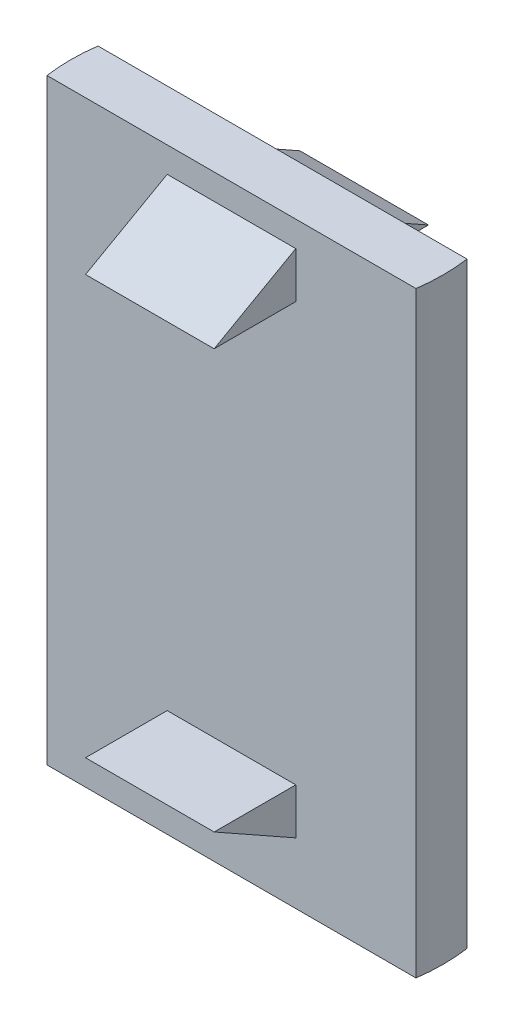
ISO-10303-21;
HEADER;
FILE_DESCRIPTION(('STEP AP214'),'2;1');
FILE_NAME('part.step','',(''),(''),'','','');
FILE_SCHEMA(('AUTOMOTIVE_DESIGN { 1 0 10303 214 1 1 1 1 }'));
ENDSEC;
DATA;
#1=APPLICATION_CONTEXT('core data for automotive mechanical design processes');
#2=APPLICATION_PROTOCOL_DEFINITION('international standard','automotive_design',2000,#1);
#3=PRODUCT_CONTEXT('',#1,'mechanical');
#4=PRODUCT('Part','Part','',(#3));
#5=PRODUCT_RELATED_PRODUCT_CATEGORY('part','',(#4));
#6=PRODUCT_DEFINITION_FORMATION('','',#4);
#7=PRODUCT_DEFINITION_CONTEXT('part definition',#1,'design');
#8=PRODUCT_DEFINITION('design','',#6,#7);
#9=PRODUCT_DEFINITION_SHAPE('','',#8);
#10=(LENGTH_UNIT() NAMED_UNIT(*) SI_UNIT(.MILLI.,.METRE.));
#11=(NAMED_UNIT(*) PLANE_ANGLE_UNIT() SI_UNIT($,.RADIAN.));
#12=(NAMED_UNIT(*) SI_UNIT($,.STERADIAN.) SOLID_ANGLE_UNIT());
#13=UNCERTAINTY_MEASURE_WITH_UNIT(LENGTH_MEASURE(1.E-05),#10,'distance_accuracy_value','');
#14=(GEOMETRIC_REPRESENTATION_CONTEXT(3) GLOBAL_UNCERTAINTY_ASSIGNED_CONTEXT((#13)) GLOBAL_UNIT_ASSIGNED_CONTEXT((#10,
#11,#12)) REPRESENTATION_CONTEXT('',''));
#15=CARTESIAN_POINT('',(0.,0.,0.));
#16=DIRECTION('',(0.,0.,1.));
#17=DIRECTION('',(1.,0.,0.));
#18=AXIS2_PLACEMENT_3D('',#15,#16,#17);
#19=CARTESIAN_POINT('',(49.53,-180.34,12.7));
#20=DIRECTION('',(0.,1.,0.));
#21=DIRECTION('',(0.,0.,1.));
#22=AXIS2_PLACEMENT_3D('',#19,#20,#21);
#23=PLANE('',#22);
#24=DIRECTION('',(0.,0.,1.));
#25=VECTOR('',#24,1.);
#26=CARTESIAN_POINT('',(-25.4,-180.34,8.89));
#27=LINE('',#26,#25);
#28=CARTESIAN_POINT('',(-25.4,-180.34,3.81));
#29=VERTEX_POINT('',#28);
#30=CARTESIAN_POINT('',(-25.4,-180.34,8.89));
#31=VERTEX_POINT('',#30);
#32=EDGE_CURVE('E62',#29,#31,#27,.T.);
#33=ORIENTED_EDGE('',*,*,#32,.T.);
#34=DIRECTION('',(1.,0.,0.));
#35=VECTOR('',#34,1.);
#36=CARTESIAN_POINT('',(25.4,-180.34,8.88999999999999));
#37=LINE('',#36,#35);
#38=CARTESIAN_POINT('',(25.4,-180.34,8.88999999999999));
#39=VERTEX_POINT('',#38);
#40=EDGE_CURVE('E212',#31,#39,#37,.T.);
#41=ORIENTED_EDGE('',*,*,#40,.T.);
#42=DIRECTION('',(0.,0.,-1.));
#43=VECTOR('',#42,1.);
#44=CARTESIAN_POINT('',(25.4,-180.34,8.88999999999999));
#45=LINE('',#44,#43);
#46=CARTESIAN_POINT('',(25.4,-180.34,3.80999999999999));
#47=VERTEX_POINT('',#46);
#48=EDGE_CURVE('E228',#39,#47,#45,.T.);
#49=ORIENTED_EDGE('',*,*,#48,.T.);
#50=DIRECTION('',(-1.,0.,0.));
#51=VECTOR('',#50,1.);
#52=CARTESIAN_POINT('',(25.4,-180.34,3.80999999999999));
#53=LINE('',#52,#51);
#54=EDGE_CURVE('E224',#47,#29,#53,.T.);
#55=ORIENTED_EDGE('',*,*,#54,.T.);
#56=EDGE_LOOP('',(#33,#41,#49,#55));
#57=FACE_BOUND('',#56,.T.);
#58=CARTESIAN_POINT('',(0.,-180.34,6.35));
#59=DIRECTION('',(0.,1.,0.));
#60=DIRECTION('',(0.,0.,1.));
#61=AXIS2_PLACEMENT_3D('',#58,#59,#60);
#62=CIRCLE('',#61,46.355);
#63=CARTESIAN_POINT('',(45.918008722069,-180.34,12.7));
#64=VERTEX_POINT('',#63);
#65=CARTESIAN_POINT('',(45.918008722069,-180.34,0.));
#66=VERTEX_POINT('',#65);
#67=EDGE_CURVE('E194',#64,#66,#62,.T.);
#68=ORIENTED_EDGE('',*,*,#67,.F.);
#69=DIRECTION('',(1.,0.,0.));
#70=VECTOR('',#69,1.);
#71=CARTESIAN_POINT('',(49.53,-180.34,12.7));
#72=LINE('',#71,#70);
#73=CARTESIAN_POINT('',(-45.9180087220689,-180.34,12.7));
#74=VERTEX_POINT('',#73);
#75=EDGE_CURVE('E48',#74,#64,#72,.T.);
#76=ORIENTED_EDGE('',*,*,#75,.F.);
#77=CARTESIAN_POINT('',(-45.9180087220689,-180.34,0.));
#78=VERTEX_POINT('',#77);
#79=EDGE_CURVE('E384',#78,#74,#62,.T.);
#80=ORIENTED_EDGE('',*,*,#79,.F.);
#81=DIRECTION('',(1.,0.,0.));
#82=VECTOR('',#81,1.);
#83=CARTESIAN_POINT('',(49.53,-180.34,0.));
#84=LINE('',#83,#82);
#85=EDGE_CURVE('E376',#78,#66,#84,.T.);
#86=ORIENTED_EDGE('',*,*,#85,.T.);
#87=EDGE_LOOP('',(#68,#76,#80,#86));
#88=FACE_BOUND('',#87,.T.);
#89=ADVANCED_FACE('F40',(#57,#88),#23,.F.);
#90=CARTESIAN_POINT('',(0.,0.,12.7));
#91=DIRECTION('',(0.,0.,1.));
#92=DIRECTION('',(1.,0.,0.));
#93=AXIS2_PLACEMENT_3D('',#90,#91,#92);
#94=PLANE('',#93);
#95=DIRECTION('',(1.,0.,0.));
#96=VECTOR('',#95,1.);
#97=CARTESIAN_POINT('',(0.,-31.75,12.7));
#98=LINE('',#97,#96);
#99=CARTESIAN_POINT('',(-45.9180087220689,-31.75,12.7));
#100=VERTEX_POINT('',#99);
#101=CARTESIAN_POINT('',(45.918008722069,-31.75,12.7));
#102=VERTEX_POINT('',#101);
#103=EDGE_CURVE('E54',#100,#102,#98,.T.);
#104=ORIENTED_EDGE('',*,*,#103,.F.);
#105=DIRECTION('',(0.,1.,0.));
#106=VECTOR('',#105,1.);
#107=CARTESIAN_POINT('',(-45.9180087220689,-180.34,12.7));
#108=LINE('',#107,#106);
#109=EDGE_CURVE('E196',#100,#74,#108,.F.);
#110=ORIENTED_EDGE('',*,*,#109,.T.);
#111=ORIENTED_EDGE('',*,*,#75,.T.);
#112=DIRECTION('',(0.,1.,0.));
#113=VECTOR('',#112,1.);
#114=CARTESIAN_POINT('',(45.918008722069,-180.34,12.7));
#115=LINE('',#114,#113);
#116=EDGE_CURVE('E200',#64,#102,#115,.T.);
#117=ORIENTED_EDGE('',*,*,#116,.T.);
#118=EDGE_LOOP('',(#104,#110,#111,#117));
#119=FACE_BOUND('',#118,.T.);
#120=DIRECTION('',(1.,0.,0.));
#121=VECTOR('',#120,1.);
#122=CARTESIAN_POINT('',(0.,-165.1,12.7));
#123=LINE('',#122,#121);
#124=CARTESIAN_POINT('',(-16.002,-165.1,12.7));
#125=VERTEX_POINT('',#124);
#126=CARTESIAN_POINT('',(16.002,-165.1,12.7));
#127=VERTEX_POINT('',#126);
#128=EDGE_CURVE('E283',#125,#127,#123,.T.);
#129=ORIENTED_EDGE('',*,*,#128,.F.);
#130=DIRECTION('',(0.,1.,0.));
#131=VECTOR('',#130,1.);
#132=CARTESIAN_POINT('',(-16.002,0.,12.7));
#133=LINE('',#132,#131);
#134=CARTESIAN_POINT('',(-16.002,-153.67,12.7));
#135=VERTEX_POINT('',#134);
#136=EDGE_CURVE('E274',#125,#135,#133,.T.);
#137=ORIENTED_EDGE('',*,*,#136,.T.);
#138=DIRECTION('',(1.,0.,0.));
#139=VECTOR('',#138,1.);
#140=CARTESIAN_POINT('',(0.,-153.67,12.7));
#141=LINE('',#140,#139);
#142=CARTESIAN_POINT('',(16.002,-153.67,12.7));
#143=VERTEX_POINT('',#142);
#144=EDGE_CURVE('E280',#135,#143,#141,.T.);
#145=ORIENTED_EDGE('',*,*,#144,.T.);
#146=DIRECTION('',(0.,1.,0.));
#147=VECTOR('',#146,1.);
#148=CARTESIAN_POINT('',(16.002,0.,12.7));
#149=LINE('',#148,#147);
#150=EDGE_CURVE('E286',#127,#143,#149,.T.);
#151=ORIENTED_EDGE('',*,*,#150,.F.);
#152=EDGE_LOOP('',(#129,#137,#145,#151));
#153=FACE_BOUND('',#152,.T.);
#154=DIRECTION('',(0.,1.,0.));
#155=VECTOR('',#154,1.);
#156=CARTESIAN_POINT('',(-16.002,0.,12.7));
#157=LINE('',#156,#155);
#158=CARTESIAN_POINT('',(-16.002,-49.53,12.7));
#159=VERTEX_POINT('',#158);
#160=CARTESIAN_POINT('',(-16.002,-38.0999999999999,12.7));
#161=VERTEX_POINT('',#160);
#162=EDGE_CURVE('E304',#159,#161,#157,.T.);
#163=ORIENTED_EDGE('',*,*,#162,.T.);
#164=DIRECTION('',(1.,0.,0.));
#165=VECTOR('',#164,1.);
#166=CARTESIAN_POINT('',(0.,-38.0999999999999,12.7));
#167=LINE('',#166,#165);
#168=CARTESIAN_POINT('',(16.002,-38.0999999999999,12.7));
#169=VERTEX_POINT('',#168);
#170=EDGE_CURVE('E312',#161,#169,#167,.T.);
#171=ORIENTED_EDGE('',*,*,#170,.T.);
#172=DIRECTION('',(0.,1.,0.));
#173=VECTOR('',#172,1.);
#174=CARTESIAN_POINT('',(16.002,0.,12.7));
#175=LINE('',#174,#173);
#176=CARTESIAN_POINT('',(16.002,-49.53,12.7));
#177=VERTEX_POINT('',#176);
#178=EDGE_CURVE('E308',#177,#169,#175,.T.);
#179=ORIENTED_EDGE('',*,*,#178,.F.);
#180=DIRECTION('',(1.,0.,0.));
#181=VECTOR('',#180,1.);
#182=CARTESIAN_POINT('',(0.,-49.53,12.7));
#183=LINE('',#182,#181);
#184=EDGE_CURVE('E299',#159,#177,#183,.T.);
#185=ORIENTED_EDGE('',*,*,#184,.F.);
#186=EDGE_LOOP('',(#163,#171,#179,#185));
#187=FACE_BOUND('',#186,.T.);
#188=ADVANCED_FACE('F395',(#119,#153,#187),#94,.T.);
#189=CARTESIAN_POINT('',(0.,0.,0.));
#190=DIRECTION('',(0.,0.,1.));
#191=DIRECTION('',(1.,0.,0.));
#192=AXIS2_PLACEMENT_3D('',#189,#190,#191);
#193=PLANE('',#192);
#194=DIRECTION('',(0.,1.,0.));
#195=VECTOR('',#194,1.);
#196=CARTESIAN_POINT('',(16.002,0.,0.));
#197=LINE('',#196,#195);
#198=CARTESIAN_POINT('',(16.002,-49.53,0.));
#199=VERTEX_POINT('',#198);
#200=CARTESIAN_POINT('',(16.002,-38.0999999999999,0.));
#201=VERTEX_POINT('',#200);
#202=EDGE_CURVE('E357',#199,#201,#197,.T.);
#203=ORIENTED_EDGE('',*,*,#202,.T.);
#204=DIRECTION('',(1.,0.,0.));
#205=VECTOR('',#204,1.);
#206=CARTESIAN_POINT('',(0.,-38.0999999999999,0.));
#207=LINE('',#206,#205);
#208=CARTESIAN_POINT('',(-16.002,-38.0999999999999,0.));
#209=VERTEX_POINT('',#208);
#210=EDGE_CURVE('E365',#209,#201,#207,.T.);
#211=ORIENTED_EDGE('',*,*,#210,.F.);
#212=DIRECTION('',(0.,1.,0.));
#213=VECTOR('',#212,1.);
#214=CARTESIAN_POINT('',(-16.002,0.,0.));
#215=LINE('',#214,#213);
#216=CARTESIAN_POINT('',(-16.002,-49.53,0.));
#217=VERTEX_POINT('',#216);
#218=EDGE_CURVE('E361',#217,#209,#215,.T.);
#219=ORIENTED_EDGE('',*,*,#218,.F.);
#220=DIRECTION('',(1.,0.,0.));
#221=VECTOR('',#220,1.);
#222=CARTESIAN_POINT('',(0.,-49.53,0.));
#223=LINE('',#222,#221);
#224=EDGE_CURVE('E351',#217,#199,#223,.T.);
#225=ORIENTED_EDGE('',*,*,#224,.T.);
#226=EDGE_LOOP('',(#203,#211,#219,#225));
#227=FACE_BOUND('',#226,.T.);
#228=DIRECTION('',(1.,0.,0.));
#229=VECTOR('',#228,1.);
#230=CARTESIAN_POINT('',(0.,-165.1,0.));
#231=LINE('',#230,#229);
#232=CARTESIAN_POINT('',(-16.002,-165.1,0.));
#233=VERTEX_POINT('',#232);
#234=CARTESIAN_POINT('',(16.002,-165.1,0.));
#235=VERTEX_POINT('',#234);
#236=EDGE_CURVE('E331',#233,#235,#231,.T.);
#237=ORIENTED_EDGE('',*,*,#236,.T.);
#238=DIRECTION('',(0.,1.,0.));
#239=VECTOR('',#238,1.);
#240=CARTESIAN_POINT('',(16.002,0.,0.));
#241=LINE('',#240,#239);
#242=CARTESIAN_POINT('',(16.002,-153.67,0.));
#243=VERTEX_POINT('',#242);
#244=EDGE_CURVE('E339',#235,#243,#241,.T.);
#245=ORIENTED_EDGE('',*,*,#244,.T.);
#246=DIRECTION('',(1.,0.,0.));
#247=VECTOR('',#246,1.);
#248=CARTESIAN_POINT('',(0.,-153.67,0.));
#249=LINE('',#248,#247);
#250=CARTESIAN_POINT('',(-16.002,-153.67,0.));
#251=VERTEX_POINT('',#250);
#252=EDGE_CURVE('E335',#251,#243,#249,.T.);
#253=ORIENTED_EDGE('',*,*,#252,.F.);
#254=DIRECTION('',(0.,1.,0.));
#255=VECTOR('',#254,1.);
#256=CARTESIAN_POINT('',(-16.002,0.,0.));
#257=LINE('',#256,#255);
#258=EDGE_CURVE('E326',#233,#251,#257,.T.);
#259=ORIENTED_EDGE('',*,*,#258,.F.);
#260=EDGE_LOOP('',(#237,#245,#253,#259));
#261=FACE_BOUND('',#260,.T.);
#262=DIRECTION('',(0.,1.,0.));
#263=VECTOR('',#262,1.);
#264=CARTESIAN_POINT('',(-45.9180087220689,-180.34,0.));
#265=LINE('',#264,#263);
#266=CARTESIAN_POINT('',(-45.9180087220689,-31.75,0.));
#267=VERTEX_POINT('',#266);
#268=EDGE_CURVE('E189',#267,#78,#265,.F.);
#269=ORIENTED_EDGE('',*,*,#268,.F.);
#270=DIRECTION('',(1.,0.,0.));
#271=VECTOR('',#270,1.);
#272=CARTESIAN_POINT('',(0.,-31.75,0.));
#273=LINE('',#272,#271);
#274=CARTESIAN_POINT('',(45.918008722069,-31.75,0.));
#275=VERTEX_POINT('',#274);
#276=EDGE_CURVE('E177',#267,#275,#273,.T.);
#277=ORIENTED_EDGE('',*,*,#276,.T.);
#278=DIRECTION('',(0.,1.,0.));
#279=VECTOR('',#278,1.);
#280=CARTESIAN_POINT('',(45.918008722069,-180.34,0.));
#281=LINE('',#280,#279);
#282=EDGE_CURVE('E187',#66,#275,#281,.T.);
#283=ORIENTED_EDGE('',*,*,#282,.F.);
#284=ORIENTED_EDGE('',*,*,#85,.F.);
#285=EDGE_LOOP('',(#269,#277,#283,#284));
#286=FACE_BOUND('',#285,.T.);
#287=ADVANCED_FACE('F185',(#227,#261,#286),#193,.F.);
#288=CARTESIAN_POINT('',(0.,-49.53,-20.32));
#289=DIRECTION('',(0.,-1.,0.));
#290=DIRECTION('',(0.,0.,-1.));
#291=AXIS2_PLACEMENT_3D('',#288,#289,#290);
#292=PLANE('',#291);
#293=ORIENTED_EDGE('',*,*,#224,.F.);
#294=DIRECTION('',(0.,0.,1.));
#295=VECTOR('',#294,1.);
#296=CARTESIAN_POINT('',(-16.002,-49.53,-20.32));
#297=LINE('',#296,#295);
#298=CARTESIAN_POINT('',(-16.002,-49.53,-20.32));
#299=VERTEX_POINT('',#298);
#300=EDGE_CURVE('E373',#299,#217,#297,.T.);
#301=ORIENTED_EDGE('',*,*,#300,.F.);
#302=DIRECTION('',(1.,0.,0.));
#303=VECTOR('',#302,1.);
#304=CARTESIAN_POINT('',(0.,-49.53,-20.32));
#305=LINE('',#304,#303);
#306=CARTESIAN_POINT('',(16.002,-49.53,-20.32));
#307=VERTEX_POINT('',#306);
#308=EDGE_CURVE('E352',#299,#307,#305,.T.);
#309=ORIENTED_EDGE('',*,*,#308,.T.);
#310=DIRECTION('',(0.,0.,1.));
#311=VECTOR('',#310,1.);
#312=CARTESIAN_POINT('',(16.002,-49.53,-20.32));
#313=LINE('',#312,#311);
#314=EDGE_CURVE('E356',#307,#199,#313,.T.);
#315=ORIENTED_EDGE('',*,*,#314,.T.);
#316=EDGE_LOOP('',(#293,#301,#309,#315));
#317=FACE_BOUND('',#316,.T.);
#318=ADVANCED_FACE('F499',(#317),#292,.T.);
#319=CARTESIAN_POINT('',(-16.002,0.,-20.32));
#320=DIRECTION('',(1.,0.,0.));
#321=DIRECTION('',(0.,0.,-1.));
#322=AXIS2_PLACEMENT_3D('',#319,#320,#321);
#323=PLANE('',#322);
#324=ORIENTED_EDGE('',*,*,#218,.T.);
#325=DIRECTION('',(0.,-0.490261239632559,-0.871575537124549));
#326=VECTOR('',#325,1.);
#327=CARTESIAN_POINT('',(-16.002,-37.6251632047477,0.844154302670604));
#328=LINE('',#327,#326);
#329=EDGE_CURVE('E270',#209,#299,#328,.T.);
#330=ORIENTED_EDGE('',*,*,#329,.T.);
#331=ORIENTED_EDGE('',*,*,#300,.T.);
#332=EDGE_LOOP('',(#324,#330,#331));
#333=FACE_BOUND('',#332,.T.);
#334=ADVANCED_FACE('F495',(#333),#323,.F.);
#335=CARTESIAN_POINT('',(16.002,0.,-20.32));
#336=DIRECTION('',(1.,0.,0.));
#337=DIRECTION('',(0.,0.,-1.));
#338=AXIS2_PLACEMENT_3D('',#335,#336,#337);
#339=PLANE('',#338);
#340=DIRECTION('',(0.,-0.490261239632559,-0.871575537124549));
#341=VECTOR('',#340,1.);
#342=CARTESIAN_POINT('',(16.002,-37.6251632047477,0.844154302670604));
#343=LINE('',#342,#341);
#344=EDGE_CURVE('E267',#201,#307,#343,.T.);
#345=ORIENTED_EDGE('',*,*,#344,.F.);
#346=ORIENTED_EDGE('',*,*,#202,.F.);
#347=ORIENTED_EDGE('',*,*,#314,.F.);
#348=EDGE_LOOP('',(#345,#346,#347));
#349=FACE_BOUND('',#348,.T.);
#350=ADVANCED_FACE('F491',(#349),#339,.T.);
#351=CARTESIAN_POINT('',(-16.002,0.,-20.32));
#352=DIRECTION('',(1.,0.,0.));
#353=DIRECTION('',(0.,0.,-1.));
#354=AXIS2_PLACEMENT_3D('',#351,#352,#353);
#355=PLANE('',#354);
#356=DIRECTION('',(0.,0.,1.));
#357=VECTOR('',#356,1.);
#358=CARTESIAN_POINT('',(-16.002,-153.67,-20.32));
#359=LINE('',#358,#357);
#360=CARTESIAN_POINT('',(-16.002,-153.67,-20.32));
#361=VERTEX_POINT('',#360);
#362=EDGE_CURVE('E348',#361,#251,#359,.T.);
#363=ORIENTED_EDGE('',*,*,#362,.F.);
#364=DIRECTION('',(0.,-0.490261239632561,0.871575537124548));
#365=VECTOR('',#364,1.);
#366=CARTESIAN_POINT('',(-16.002,-116.734480712166,-85.9831454005936));
#367=LINE('',#366,#365);
#368=EDGE_CURVE('E263',#361,#233,#367,.T.);
#369=ORIENTED_EDGE('',*,*,#368,.T.);
#370=ORIENTED_EDGE('',*,*,#258,.T.);
#371=EDGE_LOOP('',(#363,#369,#370));
#372=FACE_BOUND('',#371,.T.);
#373=ADVANCED_FACE('F487',(#372),#355,.F.);
#374=CARTESIAN_POINT('',(0.,-153.67,-20.32));
#375=DIRECTION('',(0.,-1.,0.));
#376=DIRECTION('',(0.,0.,-1.));
#377=AXIS2_PLACEMENT_3D('',#374,#375,#376);
#378=PLANE('',#377);
#379=ORIENTED_EDGE('',*,*,#252,.T.);
#380=DIRECTION('',(0.,0.,1.));
#381=VECTOR('',#380,1.);
#382=CARTESIAN_POINT('',(16.002,-153.67,-20.32));
#383=LINE('',#382,#381);
#384=CARTESIAN_POINT('',(16.002,-153.67,-20.32));
#385=VERTEX_POINT('',#384);
#386=EDGE_CURVE('E330',#385,#243,#383,.T.);
#387=ORIENTED_EDGE('',*,*,#386,.F.);
#388=DIRECTION('',(1.,0.,0.));
#389=VECTOR('',#388,1.);
#390=CARTESIAN_POINT('',(0.,-153.67,-20.32));
#391=LINE('',#390,#389);
#392=EDGE_CURVE('E327',#361,#385,#391,.T.);
#393=ORIENTED_EDGE('',*,*,#392,.F.);
#394=ORIENTED_EDGE('',*,*,#362,.T.);
#395=EDGE_LOOP('',(#379,#387,#393,#394));
#396=FACE_BOUND('',#395,.T.);
#397=ADVANCED_FACE('F483',(#396),#378,.F.);
#398=CARTESIAN_POINT('',(16.002,0.,-20.32));
#399=DIRECTION('',(1.,0.,0.));
#400=DIRECTION('',(0.,0.,-1.));
#401=AXIS2_PLACEMENT_3D('',#398,#399,#400);
#402=PLANE('',#401);
#403=DIRECTION('',(0.,-0.490261239632561,0.871575537124548));
#404=VECTOR('',#403,1.);
#405=CARTESIAN_POINT('',(16.002,-116.734480712166,-85.9831454005936));
#406=LINE('',#405,#404);
#407=EDGE_CURVE('E260',#385,#235,#406,.T.);
#408=ORIENTED_EDGE('',*,*,#407,.F.);
#409=ORIENTED_EDGE('',*,*,#386,.T.);
#410=ORIENTED_EDGE('',*,*,#244,.F.);
#411=EDGE_LOOP('',(#408,#409,#410));
#412=FACE_BOUND('',#411,.T.);
#413=ADVANCED_FACE('F479',(#412),#402,.T.);
#414=CARTESIAN_POINT('',(0.,-49.53,33.02));
#415=DIRECTION('',(0.,1.,0.));
#416=DIRECTION('',(0.,0.,1.));
#417=AXIS2_PLACEMENT_3D('',#414,#415,#416);
#418=PLANE('',#417);
#419=ORIENTED_EDGE('',*,*,#184,.T.);
#420=DIRECTION('',(0.,0.,-1.));
#421=VECTOR('',#420,1.);
#422=CARTESIAN_POINT('',(16.002,-49.53,33.02));
#423=LINE('',#422,#421);
#424=CARTESIAN_POINT('',(16.002,-49.53,33.02));
#425=VERTEX_POINT('',#424);
#426=EDGE_CURVE('E322',#425,#177,#423,.T.);
#427=ORIENTED_EDGE('',*,*,#426,.F.);
#428=DIRECTION('',(1.,0.,0.));
#429=VECTOR('',#428,1.);
#430=CARTESIAN_POINT('',(0.,-49.53,33.02));
#431=LINE('',#430,#429);
#432=CARTESIAN_POINT('',(-16.002,-49.53,33.02));
#433=VERTEX_POINT('',#432);
#434=EDGE_CURVE('E300',#433,#425,#431,.T.);
#435=ORIENTED_EDGE('',*,*,#434,.F.);
#436=DIRECTION('',(0.,0.,-1.));
#437=VECTOR('',#436,1.);
#438=CARTESIAN_POINT('',(-16.002,-49.53,33.02));
#439=LINE('',#438,#437);
#440=EDGE_CURVE('E303',#433,#159,#439,.T.);
#441=ORIENTED_EDGE('',*,*,#440,.T.);
#442=EDGE_LOOP('',(#419,#427,#435,#441));
#443=FACE_BOUND('',#442,.T.);
#444=ADVANCED_FACE('F475',(#443),#418,.F.);
#445=CARTESIAN_POINT('',(16.002,0.,33.02));
#446=DIRECTION('',(-1.,0.,0.));
#447=DIRECTION('',(0.,0.,1.));
#448=AXIS2_PLACEMENT_3D('',#445,#446,#447);
#449=PLANE('',#448);
#450=ORIENTED_EDGE('',*,*,#178,.T.);
#451=DIRECTION('',(0.,-0.490261239632559,0.871575537124549));
#452=VECTOR('',#451,1.);
#453=CARTESIAN_POINT('',(16.002,-37.6251632047477,11.8558456973294));
#454=LINE('',#453,#452);
#455=EDGE_CURVE('E256',#169,#425,#454,.T.);
#456=ORIENTED_EDGE('',*,*,#455,.T.);
#457=ORIENTED_EDGE('',*,*,#426,.T.);
#458=EDGE_LOOP('',(#450,#456,#457));
#459=FACE_BOUND('',#458,.T.);
#460=ADVANCED_FACE('F471',(#459),#449,.F.);
#461=CARTESIAN_POINT('',(-16.002,0.,33.02));
#462=DIRECTION('',(-1.,0.,0.));
#463=DIRECTION('',(0.,0.,1.));
#464=AXIS2_PLACEMENT_3D('',#461,#462,#463);
#465=PLANE('',#464);
#466=DIRECTION('',(0.,-0.490261239632559,0.871575537124549));
#467=VECTOR('',#466,1.);
#468=CARTESIAN_POINT('',(-16.002,-37.6251632047477,11.8558456973294));
#469=LINE('',#468,#467);
#470=EDGE_CURVE('E253',#161,#433,#469,.T.);
#471=ORIENTED_EDGE('',*,*,#470,.F.);
#472=ORIENTED_EDGE('',*,*,#162,.F.);
#473=ORIENTED_EDGE('',*,*,#440,.F.);
#474=EDGE_LOOP('',(#471,#472,#473));
#475=FACE_BOUND('',#474,.T.);
#476=ADVANCED_FACE('F467',(#475),#465,.T.);
#477=CARTESIAN_POINT('',(-16.002,0.,33.02));
#478=DIRECTION('',(-1.,0.,0.));
#479=DIRECTION('',(0.,0.,1.));
#480=AXIS2_PLACEMENT_3D('',#477,#478,#479);
#481=PLANE('',#480);
#482=DIRECTION('',(0.,-0.490261239632561,-0.871575537124548));
#483=VECTOR('',#482,1.);
#484=CARTESIAN_POINT('',(-16.002,-116.734480712166,98.6831454005936));
#485=LINE('',#484,#483);
#486=CARTESIAN_POINT('',(-16.002,-153.67,33.02));
#487=VERTEX_POINT('',#486);
#488=EDGE_CURVE('E250',#487,#125,#485,.T.);
#489=ORIENTED_EDGE('',*,*,#488,.F.);
#490=DIRECTION('',(0.,0.,-1.));
#491=VECTOR('',#490,1.);
#492=CARTESIAN_POINT('',(-16.002,-153.67,33.02));
#493=LINE('',#492,#491);
#494=EDGE_CURVE('E279',#487,#135,#493,.T.);
#495=ORIENTED_EDGE('',*,*,#494,.T.);
#496=ORIENTED_EDGE('',*,*,#136,.F.);
#497=EDGE_LOOP('',(#489,#495,#496));
#498=FACE_BOUND('',#497,.T.);
#499=ADVANCED_FACE('F463',(#498),#481,.T.);
#500=CARTESIAN_POINT('',(16.002,0.,33.02));
#501=DIRECTION('',(-1.,0.,0.));
#502=DIRECTION('',(0.,0.,1.));
#503=AXIS2_PLACEMENT_3D('',#500,#501,#502);
#504=PLANE('',#503);
#505=DIRECTION('',(0.,0.,-1.));
#506=VECTOR('',#505,1.);
#507=CARTESIAN_POINT('',(16.002,-153.67,33.02));
#508=LINE('',#507,#506);
#509=CARTESIAN_POINT('',(16.002,-153.67,33.02));
#510=VERTEX_POINT('',#509);
#511=EDGE_CURVE('E295',#510,#143,#508,.T.);
#512=ORIENTED_EDGE('',*,*,#511,.F.);
#513=DIRECTION('',(0.,-0.490261239632561,-0.871575537124548));
#514=VECTOR('',#513,1.);
#515=CARTESIAN_POINT('',(16.002,-116.734480712166,98.6831454005936));
#516=LINE('',#515,#514);
#517=EDGE_CURVE('E238',#510,#127,#516,.T.);
#518=ORIENTED_EDGE('',*,*,#517,.T.);
#519=ORIENTED_EDGE('',*,*,#150,.T.);
#520=EDGE_LOOP('',(#512,#518,#519));
#521=FACE_BOUND('',#520,.T.);
#522=ADVANCED_FACE('F459',(#521),#504,.F.);
#523=CARTESIAN_POINT('',(0.,-153.67,33.02));
#524=DIRECTION('',(0.,1.,0.));
#525=DIRECTION('',(0.,0.,1.));
#526=AXIS2_PLACEMENT_3D('',#523,#524,#525);
#527=PLANE('',#526);
#528=ORIENTED_EDGE('',*,*,#144,.F.);
#529=ORIENTED_EDGE('',*,*,#494,.F.);
#530=DIRECTION('',(1.,0.,0.));
#531=VECTOR('',#530,1.);
#532=CARTESIAN_POINT('',(0.,-153.67,33.02));
#533=LINE('',#532,#531);
#534=EDGE_CURVE('E275',#487,#510,#533,.T.);
#535=ORIENTED_EDGE('',*,*,#534,.T.);
#536=ORIENTED_EDGE('',*,*,#511,.T.);
#537=EDGE_LOOP('',(#528,#529,#535,#536));
#538=FACE_BOUND('',#537,.T.);
#539=ADVANCED_FACE('F449',(#538),#527,.T.);
#540=CARTESIAN_POINT('',(-38.1,-153.67,33.02));
#541=DIRECTION('',(0.,0.871575537124548,-0.490261239632561));
#542=DIRECTION('',(0.,0.490261239632561,0.871575537124548));
#543=AXIS2_PLACEMENT_3D('',#540,#541,#542);
#544=PLANE('',#543);
#545=ORIENTED_EDGE('',*,*,#488,.T.);
#546=ORIENTED_EDGE('',*,*,#128,.T.);
#547=ORIENTED_EDGE('',*,*,#517,.F.);
#548=ORIENTED_EDGE('',*,*,#534,.F.);
#549=EDGE_LOOP('',(#545,#546,#547,#548));
#550=FACE_BOUND('',#549,.T.);
#551=ADVANCED_FACE('F445',(#550),#544,.F.);
#552=CARTESIAN_POINT('',(-38.1,-38.0999999999999,12.7));
#553=DIRECTION('',(0.,-0.871575537124549,-0.490261239632559));
#554=DIRECTION('',(0.,0.490261239632559,-0.871575537124549));
#555=AXIS2_PLACEMENT_3D('',#552,#553,#554);
#556=PLANE('',#555);
#557=ORIENTED_EDGE('',*,*,#170,.F.);
#558=ORIENTED_EDGE('',*,*,#470,.T.);
#559=ORIENTED_EDGE('',*,*,#434,.T.);
#560=ORIENTED_EDGE('',*,*,#455,.F.);
#561=EDGE_LOOP('',(#557,#558,#559,#560));
#562=FACE_BOUND('',#561,.T.);
#563=ADVANCED_FACE('F441',(#562),#556,.F.);
#564=CARTESIAN_POINT('',(-38.1,-153.67,-20.32));
#565=DIRECTION('',(0.,0.871575537124548,0.490261239632561));
#566=DIRECTION('',(0.,-0.490261239632561,0.871575537124548));
#567=AXIS2_PLACEMENT_3D('',#564,#565,#566);
#568=PLANE('',#567);
#569=ORIENTED_EDGE('',*,*,#392,.T.);
#570=ORIENTED_EDGE('',*,*,#407,.T.);
#571=ORIENTED_EDGE('',*,*,#236,.F.);
#572=ORIENTED_EDGE('',*,*,#368,.F.);
#573=EDGE_LOOP('',(#569,#570,#571,#572));
#574=FACE_BOUND('',#573,.T.);
#575=ADVANCED_FACE('F444',(#574),#568,.F.);
#576=CARTESIAN_POINT('',(-38.1,-49.53,-20.32));
#577=DIRECTION('',(0.,-0.871575537124549,0.490261239632559));
#578=DIRECTION('',(0.,-0.490261239632559,-0.871575537124549));
#579=AXIS2_PLACEMENT_3D('',#576,#577,#578);
#580=PLANE('',#579);
#581=ORIENTED_EDGE('',*,*,#210,.T.);
#582=ORIENTED_EDGE('',*,*,#344,.T.);
#583=ORIENTED_EDGE('',*,*,#308,.F.);
#584=ORIENTED_EDGE('',*,*,#329,.F.);
#585=EDGE_LOOP('',(#581,#582,#583,#584));
#586=FACE_BOUND('',#585,.T.);
#587=ADVANCED_FACE('F440',(#586),#580,.F.);
#588=CARTESIAN_POINT('',(-25.4,-177.8,8.89));
#589=DIRECTION('',(1.,0.,0.));
#590=DIRECTION('',(0.,0.,-1.));
#591=AXIS2_PLACEMENT_3D('',#588,#589,#590);
#592=PLANE('',#591);
#593=ORIENTED_EDGE('',*,*,#32,.F.);
#594=DIRECTION('',(0.,-1.,0.));
#595=VECTOR('',#594,1.);
#596=CARTESIAN_POINT('',(-25.4,-177.8,3.81));
#597=LINE('',#596,#595);
#598=CARTESIAN_POINT('',(-25.4,-177.8,3.81));
#599=VERTEX_POINT('',#598);
#600=EDGE_CURVE('E221',#599,#29,#597,.T.);
#601=ORIENTED_EDGE('',*,*,#600,.F.);
#602=DIRECTION('',(0.,0.,1.));
#603=VECTOR('',#602,1.);
#604=CARTESIAN_POINT('',(-25.4,-177.8,8.89));
#605=LINE('',#604,#603);
#606=CARTESIAN_POINT('',(-25.4,-177.8,8.89));
#607=VERTEX_POINT('',#606);
#608=EDGE_CURVE('E207',#599,#607,#605,.T.);
#609=ORIENTED_EDGE('',*,*,#608,.T.);
#610=DIRECTION('',(0.,-1.,0.));
#611=VECTOR('',#610,1.);
#612=CARTESIAN_POINT('',(-25.4,-177.8,8.89));
#613=LINE('',#612,#611);
#614=EDGE_CURVE('E235',#607,#31,#613,.T.);
#615=ORIENTED_EDGE('',*,*,#614,.T.);
#616=EDGE_LOOP('',(#593,#601,#609,#615));
#617=FACE_BOUND('',#616,.T.);
#618=ADVANCED_FACE('F421',(#617),#592,.T.);
#619=CARTESIAN_POINT('',(25.4,-177.8,8.88999999999999));
#620=DIRECTION('',(0.,0.,-1.));
#621=DIRECTION('',(-1.,0.,0.));
#622=AXIS2_PLACEMENT_3D('',#619,#620,#621);
#623=PLANE('',#622);
#624=ORIENTED_EDGE('',*,*,#40,.F.);
#625=ORIENTED_EDGE('',*,*,#614,.F.);
#626=DIRECTION('',(1.,0.,0.));
#627=VECTOR('',#626,1.);
#628=CARTESIAN_POINT('',(25.4,-177.8,8.88999999999999));
#629=LINE('',#628,#627);
#630=CARTESIAN_POINT('',(25.4,-177.8,8.88999999999999));
#631=VERTEX_POINT('',#630);
#632=EDGE_CURVE('E218',#607,#631,#629,.T.);
#633=ORIENTED_EDGE('',*,*,#632,.T.);
#634=DIRECTION('',(0.,-1.,0.));
#635=VECTOR('',#634,1.);
#636=CARTESIAN_POINT('',(25.4,-177.8,8.88999999999999));
#637=LINE('',#636,#635);
#638=EDGE_CURVE('E239',#631,#39,#637,.T.);
#639=ORIENTED_EDGE('',*,*,#638,.T.);
#640=EDGE_LOOP('',(#624,#625,#633,#639));
#641=FACE_BOUND('',#640,.T.);
#642=ADVANCED_FACE('F426',(#641),#623,.T.);
#643=CARTESIAN_POINT('',(25.4,-177.8,8.88999999999999));
#644=DIRECTION('',(-1.,0.,0.));
#645=DIRECTION('',(0.,0.,1.));
#646=AXIS2_PLACEMENT_3D('',#643,#644,#645);
#647=PLANE('',#646);
#648=ORIENTED_EDGE('',*,*,#48,.F.);
#649=ORIENTED_EDGE('',*,*,#638,.F.);
#650=DIRECTION('',(0.,0.,-1.));
#651=VECTOR('',#650,1.);
#652=CARTESIAN_POINT('',(25.4,-177.8,8.88999999999999));
#653=LINE('',#652,#651);
#654=CARTESIAN_POINT('',(25.4,-177.8,3.80999999999999));
#655=VERTEX_POINT('',#654);
#656=EDGE_CURVE('E215',#631,#655,#653,.T.);
#657=ORIENTED_EDGE('',*,*,#656,.T.);
#658=DIRECTION('',(0.,-1.,0.));
#659=VECTOR('',#658,1.);
#660=CARTESIAN_POINT('',(25.4,-177.8,3.80999999999999));
#661=LINE('',#660,#659);
#662=EDGE_CURVE('E242',#655,#47,#661,.T.);
#663=ORIENTED_EDGE('',*,*,#662,.T.);
#664=EDGE_LOOP('',(#648,#649,#657,#663));
#665=FACE_BOUND('',#664,.T.);
#666=ADVANCED_FACE('F428',(#665),#647,.T.);
#667=CARTESIAN_POINT('',(25.4,-177.8,3.80999999999999));
#668=DIRECTION('',(0.,0.,1.));
#669=DIRECTION('',(1.,0.,0.));
#670=AXIS2_PLACEMENT_3D('',#667,#668,#669);
#671=PLANE('',#670);
#672=ORIENTED_EDGE('',*,*,#54,.F.);
#673=ORIENTED_EDGE('',*,*,#662,.F.);
#674=DIRECTION('',(-1.,0.,0.));
#675=VECTOR('',#674,1.);
#676=CARTESIAN_POINT('',(25.4,-177.8,3.80999999999999));
#677=LINE('',#676,#675);
#678=EDGE_CURVE('E211',#655,#599,#677,.T.);
#679=ORIENTED_EDGE('',*,*,#678,.T.);
#680=ORIENTED_EDGE('',*,*,#600,.T.);
#681=EDGE_LOOP('',(#672,#673,#679,#680));
#682=FACE_BOUND('',#681,.T.);
#683=ADVANCED_FACE('F405',(#682),#671,.T.);
#684=CARTESIAN_POINT('',(0.,-177.8,0.));
#685=DIRECTION('',(0.,-1.,0.));
#686=DIRECTION('',(0.,0.,1.));
#687=AXIS2_PLACEMENT_3D('',#684,#685,#686);
#688=PLANE('',#687);
#689=ORIENTED_EDGE('',*,*,#608,.F.);
#690=ORIENTED_EDGE('',*,*,#678,.F.);
#691=ORIENTED_EDGE('',*,*,#656,.F.);
#692=ORIENTED_EDGE('',*,*,#632,.F.);
#693=EDGE_LOOP('',(#689,#690,#691,#692));
#694=FACE_BOUND('',#693,.T.);
#695=ADVANCED_FACE('F399',(#694),#688,.T.);
#696=CARTESIAN_POINT('',(0.,-180.34,6.35));
#697=DIRECTION('',(0.,1.,0.));
#698=DIRECTION('',(0.,0.,1.));
#699=AXIS2_PLACEMENT_3D('',#696,#697,#698);
#700=CYLINDRICAL_SURFACE('',#699,46.355);
#701=CARTESIAN_POINT('',(0.,-31.75,6.35));
#702=DIRECTION('',(0.,-1.,0.));
#703=DIRECTION('',(0.,0.,-1.));
#704=AXIS2_PLACEMENT_3D('',#701,#702,#703);
#705=CIRCLE('',#704,46.355);
#706=EDGE_CURVE('E388',#267,#100,#705,.F.);
#707=ORIENTED_EDGE('',*,*,#706,.F.);
#708=ORIENTED_EDGE('',*,*,#268,.T.);
#709=ORIENTED_EDGE('',*,*,#79,.T.);
#710=ORIENTED_EDGE('',*,*,#109,.F.);
#711=EDGE_LOOP('',(#707,#708,#709,#710));
#712=FACE_BOUND('',#711,.T.);
#713=ADVANCED_FACE('F397',(#712),#700,.T.);
#714=CARTESIAN_POINT('',(0.,-31.75,6.35));
#715=DIRECTION('',(0.,-1.,0.));
#716=DIRECTION('',(0.,0.,-1.));
#717=AXIS2_PLACEMENT_3D('',#714,#715,#716);
#718=CIRCLE('',#717,46.355);
#719=EDGE_CURVE('E11',#102,#275,#718,.F.);
#720=ORIENTED_EDGE('',*,*,#719,.F.);
#721=ORIENTED_EDGE('',*,*,#116,.F.);
#722=ORIENTED_EDGE('',*,*,#67,.T.);
#723=ORIENTED_EDGE('',*,*,#282,.T.);
#724=EDGE_LOOP('',(#720,#721,#722,#723));
#725=FACE_BOUND('',#724,.T.);
#726=ADVANCED_FACE('F192',(#725),#700,.T.);
#727=CARTESIAN_POINT('',(-77.6411193012019,-31.75,-25.4));
#728=DIRECTION('',(0.,-1.,0.));
#729=DIRECTION('',(0.,0.,-1.));
#730=AXIS2_PLACEMENT_3D('',#727,#728,#729);
#731=PLANE('',#730);
#732=ORIENTED_EDGE('',*,*,#706,.T.);
#733=ORIENTED_EDGE('',*,*,#103,.T.);
#734=ORIENTED_EDGE('',*,*,#719,.T.);
#735=ORIENTED_EDGE('',*,*,#276,.F.);
#736=EDGE_LOOP('',(#732,#733,#734,#735));
#737=FACE_BOUND('',#736,.T.);
#738=ADVANCED_FACE('F176',(#737),#731,.F.);
#739=CLOSED_SHELL('',(#89,#188,#287,#318,#334,#350,#373,#397,#413,#444,#460,#476,#499,#522,#539,
#551,#563,#575,#587,#618,#642,#666,#683,#695,#713,#726,#738));
#740=MANIFOLD_SOLID_BREP('B2',#739);
#741=ADVANCED_BREP_SHAPE_REPRESENTATION('',(#18,#740),#14);
#742=SHAPE_DEFINITION_REPRESENTATION(#9,#741);
ENDSEC;
END-ISO-10303-21;
